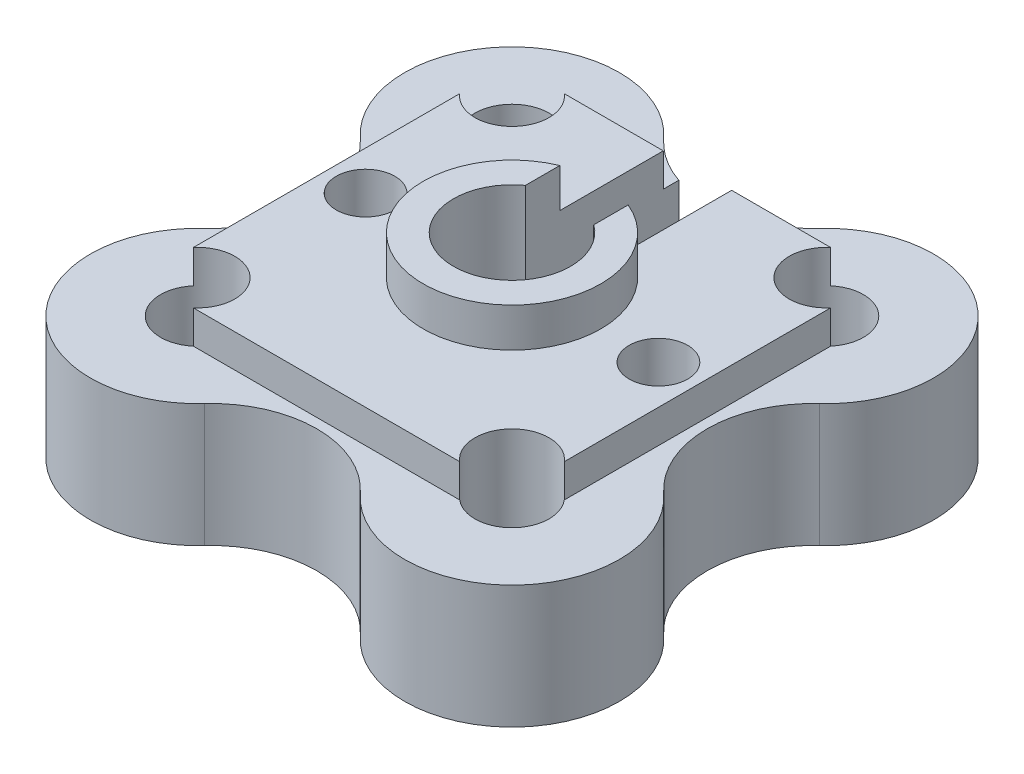
ISO-10303-21;
HEADER;
FILE_DESCRIPTION(('STEP AP214'),'2;1');
FILE_NAME('part.step','',(''),(''),'','','');
FILE_SCHEMA(('AUTOMOTIVE_DESIGN { 1 0 10303 214 1 1 1 1 }'));
ENDSEC;
DATA;
#1=APPLICATION_CONTEXT('core data for automotive mechanical design processes');
#2=APPLICATION_PROTOCOL_DEFINITION('international standard','automotive_design',2000,#1);
#3=PRODUCT_CONTEXT('',#1,'mechanical');
#4=PRODUCT('Part','Part','',(#3));
#5=PRODUCT_RELATED_PRODUCT_CATEGORY('part','',(#4));
#6=PRODUCT_DEFINITION_FORMATION('','',#4);
#7=PRODUCT_DEFINITION_CONTEXT('part definition',#1,'design');
#8=PRODUCT_DEFINITION('design','',#6,#7);
#9=PRODUCT_DEFINITION_SHAPE('','',#8);
#10=(LENGTH_UNIT() NAMED_UNIT(*) SI_UNIT(.MILLI.,.METRE.));
#11=(NAMED_UNIT(*) PLANE_ANGLE_UNIT() SI_UNIT($,.RADIAN.));
#12=(NAMED_UNIT(*) SI_UNIT($,.STERADIAN.) SOLID_ANGLE_UNIT());
#13=UNCERTAINTY_MEASURE_WITH_UNIT(LENGTH_MEASURE(1.E-05),#10,'distance_accuracy_value','');
#14=(GEOMETRIC_REPRESENTATION_CONTEXT(3) GLOBAL_UNCERTAINTY_ASSIGNED_CONTEXT((#13)) GLOBAL_UNIT_ASSIGNED_CONTEXT((#10,
#11,#12)) REPRESENTATION_CONTEXT('',''));
#15=CARTESIAN_POINT('',(0.,0.,0.));
#16=DIRECTION('',(0.,0.,1.));
#17=DIRECTION('',(1.,0.,0.));
#18=AXIS2_PLACEMENT_3D('',#15,#16,#17);
#19=CARTESIAN_POINT('',(0.,6.3,-15.4021126760563));
#20=DIRECTION('',(0.,-1.,0.));
#21=DIRECTION('',(0.,0.,-1.));
#22=AXIS2_PLACEMENT_3D('',#19,#20,#21);
#23=CYLINDRICAL_SURFACE('',#22,5.40211267605633);
#24=CARTESIAN_POINT('',(0.,6.3,-15.4021126760563));
#25=DIRECTION('',(0.,-1.,0.));
#26=DIRECTION('',(0.,0.,1.));
#27=AXIS2_PLACEMENT_3D('',#24,#25,#26);
#28=CIRCLE('',#27,5.40211267605633);
#29=CARTESIAN_POINT('',(-1.75,6.3,-10.2913083005389));
#30=VERTEX_POINT('',#29);
#31=CARTESIAN_POINT('',(-3.98886053872489,6.3,-11.7590627220464));
#32=VERTEX_POINT('',#31);
#33=EDGE_CURVE('E365',#30,#32,#28,.T.);
#34=ORIENTED_EDGE('',*,*,#33,.F.);
#35=DIRECTION('',(0.,-1.,0.));
#36=VECTOR('',#35,1.);
#37=CARTESIAN_POINT('',(-1.75,6.3,-10.2913083005389));
#38=LINE('',#37,#36);
#39=CARTESIAN_POINT('',(-1.75,0.,-10.2913083005389));
#40=VERTEX_POINT('',#39);
#41=EDGE_CURVE('E446',#30,#40,#38,.T.);
#42=ORIENTED_EDGE('',*,*,#41,.T.);
#43=CARTESIAN_POINT('',(0.,0.,-15.4021126760563));
#44=DIRECTION('',(0.,-1.,0.));
#45=DIRECTION('',(0.,0.,1.));
#46=AXIS2_PLACEMENT_3D('',#43,#44,#45);
#47=CIRCLE('',#46,5.40211267605633);
#48=CARTESIAN_POINT('',(-3.98886053872489,0.,-11.7590627220464));
#49=VERTEX_POINT('',#48);
#50=EDGE_CURVE('E385',#40,#49,#47,.T.);
#51=ORIENTED_EDGE('',*,*,#50,.T.);
#52=DIRECTION('',(0.,-1.,0.));
#53=VECTOR('',#52,1.);
#54=CARTESIAN_POINT('',(-3.98886053872489,6.3,-11.7590627220464));
#55=LINE('',#54,#53);
#56=EDGE_CURVE('E234',#32,#49,#55,.T.);
#57=ORIENTED_EDGE('',*,*,#56,.F.);
#58=EDGE_LOOP('',(#34,#42,#51,#57));
#59=FACE_BOUND('',#58,.T.);
#60=ADVANCED_FACE('F34',(#59),#23,.F.);
#61=CARTESIAN_POINT('',(6.82219708423337,8.,-9.5));
#62=DIRECTION('',(0.,0.,1.));
#63=DIRECTION('',(1.,0.,0.));
#64=AXIS2_PLACEMENT_3D('',#61,#62,#63);
#65=PLANE('',#64);
#66=DIRECTION('',(-1.,0.,0.));
#67=VECTOR('',#66,1.);
#68=CARTESIAN_POINT('',(6.82219708423337,8.,-9.5));
#69=LINE('',#68,#67);
#70=CARTESIAN_POINT('',(-1.75,8.,-9.5));
#71=VERTEX_POINT('',#70);
#72=CARTESIAN_POINT('',(-6.82219708421912,8.,-9.5));
#73=VERTEX_POINT('',#72);
#74=EDGE_CURVE('E470',#71,#73,#69,.T.);
#75=ORIENTED_EDGE('',*,*,#74,.F.);
#76=DIRECTION('',(0.,-1.,0.));
#77=VECTOR('',#76,1.);
#78=CARTESIAN_POINT('',(-1.75,8.,-9.5));
#79=LINE('',#78,#77);
#80=CARTESIAN_POINT('',(-1.75,6.3,-9.5));
#81=VERTEX_POINT('',#80);
#82=EDGE_CURVE('E451',#71,#81,#79,.T.);
#83=ORIENTED_EDGE('',*,*,#82,.T.);
#84=DIRECTION('',(-1.,0.,0.));
#85=VECTOR('',#84,1.);
#86=CARTESIAN_POINT('',(6.82219708423337,6.3,-9.5));
#87=LINE('',#86,#85);
#88=CARTESIAN_POINT('',(-6.82219708421913,6.3,-9.5));
#89=VERTEX_POINT('',#88);
#90=EDGE_CURVE('E38',#81,#89,#87,.T.);
#91=ORIENTED_EDGE('',*,*,#90,.T.);
#92=DIRECTION('',(0.,-1.,0.));
#93=VECTOR('',#92,1.);
#94=CARTESIAN_POINT('',(-6.82219708421912,8.,-9.5));
#95=LINE('',#94,#93);
#96=EDGE_CURVE('E243',#73,#89,#95,.T.);
#97=ORIENTED_EDGE('',*,*,#96,.F.);
#98=EDGE_LOOP('',(#75,#83,#91,#97));
#99=FACE_BOUND('',#98,.T.);
#100=ADVANCED_FACE('F514',(#99),#65,.F.);
#101=CARTESIAN_POINT('',(8.05,8.,8.05));
#102=DIRECTION('',(0.,1.,0.));
#103=DIRECTION('',(0.,0.,1.));
#104=AXIS2_PLACEMENT_3D('',#101,#102,#103);
#105=PLANE('',#104);
#106=DIRECTION('',(0.,0.,1.));
#107=VECTOR('',#106,1.);
#108=CARTESIAN_POINT('',(-1.75,8.,8.05));
#109=LINE('',#108,#107);
#110=CARTESIAN_POINT('',(-1.75,8.,-4.2));
#111=VERTEX_POINT('',#110);
#112=EDGE_CURVE('E510',#71,#111,#109,.T.);
#113=ORIENTED_EDGE('',*,*,#112,.F.);
#114=ORIENTED_EDGE('',*,*,#74,.T.);
#115=CARTESIAN_POINT('',(-8.05,8.,-8.05));
#116=DIRECTION('',(0.,-1.,0.));
#117=DIRECTION('',(0.,0.,1.));
#118=AXIS2_PLACEMENT_3D('',#115,#116,#117);
#119=CIRCLE('',#118,1.9);
#120=CARTESIAN_POINT('',(-9.5,8.,-6.82219708421913));
#121=VERTEX_POINT('',#120);
#122=EDGE_CURVE('E285',#73,#121,#119,.T.);
#123=ORIENTED_EDGE('',*,*,#122,.T.);
#124=DIRECTION('',(0.,0.,1.));
#125=VECTOR('',#124,1.);
#126=CARTESIAN_POINT('',(-9.5,8.,-6.82219708421913));
#127=LINE('',#126,#125);
#128=CARTESIAN_POINT('',(-9.5,8.,6.82219708423032));
#129=VERTEX_POINT('',#128);
#130=EDGE_CURVE('E281',#121,#129,#127,.T.);
#131=ORIENTED_EDGE('',*,*,#130,.T.);
#132=CARTESIAN_POINT('',(-8.05,8.,8.05));
#133=DIRECTION('',(0.,-1.,0.));
#134=DIRECTION('',(0.,0.,1.));
#135=AXIS2_PLACEMENT_3D('',#132,#133,#134);
#136=CIRCLE('',#135,1.89999999999277);
#137=CARTESIAN_POINT('',(-6.82219708423033,8.,9.5));
#138=VERTEX_POINT('',#137);
#139=EDGE_CURVE('E336',#129,#138,#136,.T.);
#140=ORIENTED_EDGE('',*,*,#139,.T.);
#141=DIRECTION('',(1.,0.,0.));
#142=VECTOR('',#141,1.);
#143=CARTESIAN_POINT('',(-6.82219708423033,8.,9.5));
#144=LINE('',#143,#142);
#145=CARTESIAN_POINT('',(6.82219708421913,8.,9.5));
#146=VERTEX_POINT('',#145);
#147=EDGE_CURVE('E324',#138,#146,#144,.T.);
#148=ORIENTED_EDGE('',*,*,#147,.T.);
#149=CARTESIAN_POINT('',(8.05,8.,8.05));
#150=DIRECTION('',(0.,-1.,0.));
#151=DIRECTION('',(0.,0.,1.));
#152=AXIS2_PLACEMENT_3D('',#149,#150,#151);
#153=CIRCLE('',#152,1.9);
#154=CARTESIAN_POINT('',(9.5,8.,6.82219708421914));
#155=VERTEX_POINT('',#154);
#156=EDGE_CURVE('E320',#146,#155,#153,.T.);
#157=ORIENTED_EDGE('',*,*,#156,.T.);
#158=DIRECTION('',(0.,0.,-1.));
#159=VECTOR('',#158,1.);
#160=CARTESIAN_POINT('',(9.5,8.,6.82219708421914));
#161=LINE('',#160,#159);
#162=CARTESIAN_POINT('',(9.5,8.,-6.82219708423337));
#163=VERTEX_POINT('',#162);
#164=EDGE_CURVE('E466',#155,#163,#161,.T.);
#165=ORIENTED_EDGE('',*,*,#164,.T.);
#166=CARTESIAN_POINT('',(8.05,8.,-8.05));
#167=DIRECTION('',(0.,-1.,0.));
#168=DIRECTION('',(0.,0.,1.));
#169=AXIS2_PLACEMENT_3D('',#166,#167,#168);
#170=CIRCLE('',#169,1.8999999999908);
#171=CARTESIAN_POINT('',(6.82219708423337,8.,-9.5));
#172=VERTEX_POINT('',#171);
#173=EDGE_CURVE('E468',#163,#172,#170,.T.);
#174=ORIENTED_EDGE('',*,*,#173,.T.);
#175=CARTESIAN_POINT('',(1.75,8.,-9.5));
#176=VERTEX_POINT('',#175);
#177=EDGE_CURVE('E471',#172,#176,#69,.T.);
#178=ORIENTED_EDGE('',*,*,#177,.T.);
#179=DIRECTION('',(0.,0.,-1.));
#180=VECTOR('',#179,1.);
#181=CARTESIAN_POINT('',(1.75,8.,8.05));
#182=LINE('',#181,#180);
#183=CARTESIAN_POINT('',(1.75,8.,-4.2));
#184=VERTEX_POINT('',#183);
#185=EDGE_CURVE('E497',#184,#176,#182,.T.);
#186=ORIENTED_EDGE('',*,*,#185,.F.);
#187=CARTESIAN_POINT('',(0.,8.,0.));
#188=DIRECTION('',(0.,1.,0.));
#189=DIRECTION('',(0.,0.,1.));
#190=AXIS2_PLACEMENT_3D('',#187,#188,#189);
#191=CIRCLE('',#190,4.55);
#192=EDGE_CURVE('E459',#111,#184,#191,.T.);
#193=ORIENTED_EDGE('',*,*,#192,.F.);
#194=EDGE_LOOP('',(#113,#114,#123,#131,#140,#148,#157,#165,#174,#178,#186,#193));
#195=FACE_BOUND('',#194,.T.);
#196=CARTESIAN_POINT('',(-7.5,8.,0.));
#197=DIRECTION('',(0.,1.,0.));
#198=DIRECTION('',(0.,0.,1.));
#199=AXIS2_PLACEMENT_3D('',#196,#197,#198);
#200=CIRCLE('',#199,1.5);
#201=CARTESIAN_POINT('',(-7.5,8.,1.5));
#202=VERTEX_POINT('',#201);
#203=EDGE_CURVE('E456',#202,#202,#200,.F.);
#204=ORIENTED_EDGE('',*,*,#203,.T.);
#205=EDGE_LOOP('',(#204));
#206=FACE_BOUND('',#205,.T.);
#207=CARTESIAN_POINT('',(7.5,8.,0.));
#208=DIRECTION('',(0.,1.,0.));
#209=DIRECTION('',(0.,0.,1.));
#210=AXIS2_PLACEMENT_3D('',#207,#208,#209);
#211=CIRCLE('',#210,1.5);
#212=CARTESIAN_POINT('',(7.5,8.,1.5));
#213=VERTEX_POINT('',#212);
#214=EDGE_CURVE('E447',#213,#213,#211,.F.);
#215=ORIENTED_EDGE('',*,*,#214,.T.);
#216=EDGE_LOOP('',(#215));
#217=FACE_BOUND('',#216,.T.);
#218=ADVANCED_FACE('F478',(#195,#206,#217),#105,.T.);
#219=CARTESIAN_POINT('',(4.025,0.,-11.7260563380282));
#220=DIRECTION('',(0.,1.,0.));
#221=DIRECTION('',(0.,0.,1.));
#222=AXIS2_PLACEMENT_3D('',#219,#220,#221);
#223=PLANE('',#222);
#224=CARTESIAN_POINT('',(7.5,0.,0.));
#225=DIRECTION('',(0.,1.,0.));
#226=DIRECTION('',(0.,0.,1.));
#227=AXIS2_PLACEMENT_3D('',#224,#225,#226);
#228=CIRCLE('',#227,1.5);
#229=CARTESIAN_POINT('',(7.5,0.,1.5));
#230=VERTEX_POINT('',#229);
#231=EDGE_CURVE('E293',#230,#230,#228,.T.);
#232=ORIENTED_EDGE('',*,*,#231,.T.);
#233=EDGE_LOOP('',(#232));
#234=FACE_BOUND('',#233,.T.);
#235=CARTESIAN_POINT('',(-7.5,0.,0.));
#236=DIRECTION('',(0.,1.,0.));
#237=DIRECTION('',(0.,0.,1.));
#238=AXIS2_PLACEMENT_3D('',#235,#236,#237);
#239=CIRCLE('',#238,1.5);
#240=CARTESIAN_POINT('',(-7.5,0.,1.5));
#241=VERTEX_POINT('',#240);
#242=EDGE_CURVE('E358',#241,#241,#239,.T.);
#243=ORIENTED_EDGE('',*,*,#242,.T.);
#244=EDGE_LOOP('',(#243));
#245=FACE_BOUND('',#244,.T.);
#246=ORIENTED_EDGE('',*,*,#50,.F.);
#247=DIRECTION('',(0.,0.,1.));
#248=VECTOR('',#247,1.);
#249=CARTESIAN_POINT('',(-1.75,0.,0.));
#250=LINE('',#249,#248);
#251=CARTESIAN_POINT('',(-1.75,0.,0.));
#252=VERTEX_POINT('',#251);
#253=EDGE_CURVE('E527',#40,#252,#250,.T.);
#254=ORIENTED_EDGE('',*,*,#253,.T.);
#255=CARTESIAN_POINT('',(0.,0.,0.));
#256=DIRECTION('',(0.,1.,0.));
#257=DIRECTION('',(0.,0.,-1.));
#258=AXIS2_PLACEMENT_3D('',#255,#256,#257);
#259=CIRCLE('',#258,1.75);
#260=CARTESIAN_POINT('',(1.75,0.,0.));
#261=VERTEX_POINT('',#260);
#262=EDGE_CURVE('E225',#252,#261,#259,.T.);
#263=ORIENTED_EDGE('',*,*,#262,.T.);
#264=DIRECTION('',(0.,0.,-1.));
#265=VECTOR('',#264,1.);
#266=CARTESIAN_POINT('',(1.75,0.,0.));
#267=LINE('',#266,#265);
#268=CARTESIAN_POINT('',(1.75,0.,-10.2913083005389));
#269=VERTEX_POINT('',#268);
#270=EDGE_CURVE('E523',#261,#269,#267,.T.);
#271=ORIENTED_EDGE('',*,*,#270,.T.);
#272=CARTESIAN_POINT('',(3.98886053872489,0.,-11.7590627220464));
#273=VERTEX_POINT('',#272);
#274=EDGE_CURVE('E386',#273,#269,#47,.T.);
#275=ORIENTED_EDGE('',*,*,#274,.F.);
#276=CARTESIAN_POINT('',(8.05,0.,-8.05));
#277=DIRECTION('',(0.,1.,0.));
#278=DIRECTION('',(0.,0.,1.));
#279=AXIS2_PLACEMENT_3D('',#276,#277,#278);
#280=CIRCLE('',#279,5.5);
#281=CARTESIAN_POINT('',(11.7590627220464,0.,-3.98886053872489));
#282=VERTEX_POINT('',#281);
#283=EDGE_CURVE('E361',#282,#273,#280,.T.);
#284=ORIENTED_EDGE('',*,*,#283,.F.);
#285=CARTESIAN_POINT('',(15.4021126760563,0.,0.));
#286=DIRECTION('',(0.,-1.,0.));
#287=DIRECTION('',(0.,0.,1.));
#288=AXIS2_PLACEMENT_3D('',#285,#286,#287);
#289=CIRCLE('',#288,5.40211267605634);
#290=CARTESIAN_POINT('',(11.7590627220464,0.,3.98886053872489));
#291=VERTEX_POINT('',#290);
#292=EDGE_CURVE('E366',#291,#282,#289,.T.);
#293=ORIENTED_EDGE('',*,*,#292,.F.);
#294=CARTESIAN_POINT('',(8.05,0.,8.05));
#295=DIRECTION('',(0.,1.,0.));
#296=DIRECTION('',(0.,0.,-1.));
#297=AXIS2_PLACEMENT_3D('',#294,#295,#296);
#298=CIRCLE('',#297,5.5);
#299=CARTESIAN_POINT('',(3.98886053872489,0.,11.7590627220464));
#300=VERTEX_POINT('',#299);
#301=EDGE_CURVE('E397',#300,#291,#298,.T.);
#302=ORIENTED_EDGE('',*,*,#301,.F.);
#303=CARTESIAN_POINT('',(0.,0.,15.4021126760563));
#304=DIRECTION('',(0.,-1.,0.));
#305=DIRECTION('',(0.,0.,-1.));
#306=AXIS2_PLACEMENT_3D('',#303,#304,#305);
#307=CIRCLE('',#306,5.40211267605633);
#308=CARTESIAN_POINT('',(-3.98886053872489,0.,11.7590627220464));
#309=VERTEX_POINT('',#308);
#310=EDGE_CURVE('E395',#309,#300,#307,.T.);
#311=ORIENTED_EDGE('',*,*,#310,.F.);
#312=CARTESIAN_POINT('',(-8.05,0.,8.05));
#313=DIRECTION('',(0.,1.,0.));
#314=DIRECTION('',(0.,0.,-1.));
#315=AXIS2_PLACEMENT_3D('',#312,#313,#314);
#316=CIRCLE('',#315,5.5);
#317=CARTESIAN_POINT('',(-11.7590627220464,0.,3.98886053872489));
#318=VERTEX_POINT('',#317);
#319=EDGE_CURVE('E393',#318,#309,#316,.T.);
#320=ORIENTED_EDGE('',*,*,#319,.F.);
#321=CARTESIAN_POINT('',(-15.4021126760563,0.,0.));
#322=DIRECTION('',(0.,-1.,0.));
#323=DIRECTION('',(0.,0.,1.));
#324=AXIS2_PLACEMENT_3D('',#321,#322,#323);
#325=CIRCLE('',#324,5.40211267605634);
#326=CARTESIAN_POINT('',(-11.7590627220464,0.,-3.98886053872489));
#327=VERTEX_POINT('',#326);
#328=EDGE_CURVE('E391',#327,#318,#325,.T.);
#329=ORIENTED_EDGE('',*,*,#328,.F.);
#330=CARTESIAN_POINT('',(-8.05,0.,-8.05));
#331=DIRECTION('',(0.,1.,0.));
#332=DIRECTION('',(0.,0.,1.));
#333=AXIS2_PLACEMENT_3D('',#330,#331,#332);
#334=CIRCLE('',#333,5.5);
#335=EDGE_CURVE('E389',#49,#327,#334,.T.);
#336=ORIENTED_EDGE('',*,*,#335,.F.);
#337=EDGE_LOOP('',(#246,#254,#263,#271,#275,#284,#293,#302,#311,#320,#329,#336));
#338=FACE_BOUND('',#337,.T.);
#339=ADVANCED_FACE('F429',(#234,#245,#338),#223,.F.);
#340=CARTESIAN_POINT('',(0.,10.,0.));
#341=DIRECTION('',(0.,1.,0.));
#342=DIRECTION('',(0.,0.,1.));
#343=AXIS2_PLACEMENT_3D('',#340,#341,#342);
#344=PLANE('',#343);
#345=DIRECTION('',(0.,0.,1.));
#346=VECTOR('',#345,1.);
#347=CARTESIAN_POINT('',(-1.75,10.,0.));
#348=LINE('',#347,#346);
#349=CARTESIAN_POINT('',(-1.75,10.,-4.2));
#350=VERTEX_POINT('',#349);
#351=CARTESIAN_POINT('',(-1.75,10.,-2.43669858620224));
#352=VERTEX_POINT('',#351);
#353=EDGE_CURVE('E50',#350,#352,#348,.T.);
#354=ORIENTED_EDGE('',*,*,#353,.F.);
#355=CARTESIAN_POINT('',(0.,10.,0.));
#356=DIRECTION('',(0.,1.,0.));
#357=DIRECTION('',(0.,0.,1.));
#358=AXIS2_PLACEMENT_3D('',#355,#356,#357);
#359=CIRCLE('',#358,4.55);
#360=CARTESIAN_POINT('',(1.75,10.,-4.2));
#361=VERTEX_POINT('',#360);
#362=EDGE_CURVE('E307',#350,#361,#359,.T.);
#363=ORIENTED_EDGE('',*,*,#362,.T.);
#364=DIRECTION('',(0.,0.,-1.));
#365=VECTOR('',#364,1.);
#366=CARTESIAN_POINT('',(1.75,10.,0.));
#367=LINE('',#366,#365);
#368=CARTESIAN_POINT('',(1.75,10.,-2.43669858620224));
#369=VERTEX_POINT('',#368);
#370=EDGE_CURVE('E524',#369,#361,#367,.T.);
#371=ORIENTED_EDGE('',*,*,#370,.F.);
#372=CARTESIAN_POINT('',(0.,10.,0.));
#373=DIRECTION('',(0.,1.,0.));
#374=DIRECTION('',(0.,0.,1.));
#375=AXIS2_PLACEMENT_3D('',#372,#373,#374);
#376=CIRCLE('',#375,3.);
#377=EDGE_CURVE('E230',#352,#369,#376,.T.);
#378=ORIENTED_EDGE('',*,*,#377,.F.);
#379=EDGE_LOOP('',(#354,#363,#371,#378));
#380=FACE_BOUND('',#379,.T.);
#381=ADVANCED_FACE('F522',(#380),#344,.T.);
#382=CARTESIAN_POINT('',(4.025,6.3,-11.7260563380282));
#383=DIRECTION('',(0.,1.,0.));
#384=DIRECTION('',(0.,0.,1.));
#385=AXIS2_PLACEMENT_3D('',#382,#383,#384);
#386=PLANE('',#385);
#387=DIRECTION('',(0.,0.,1.));
#388=VECTOR('',#387,1.);
#389=CARTESIAN_POINT('',(-1.75,6.3,-11.7260563380282));
#390=LINE('',#389,#388);
#391=EDGE_CURVE('E444',#30,#81,#390,.T.);
#392=ORIENTED_EDGE('',*,*,#391,.F.);
#393=ORIENTED_EDGE('',*,*,#33,.T.);
#394=CARTESIAN_POINT('',(-8.05,6.3,-8.05));
#395=DIRECTION('',(0.,1.,0.));
#396=DIRECTION('',(0.,0.,1.));
#397=AXIS2_PLACEMENT_3D('',#394,#395,#396);
#398=CIRCLE('',#397,5.5);
#399=CARTESIAN_POINT('',(-11.7590627220464,6.3,-3.98886053872489));
#400=VERTEX_POINT('',#399);
#401=EDGE_CURVE('E370',#32,#400,#398,.T.);
#402=ORIENTED_EDGE('',*,*,#401,.T.);
#403=CARTESIAN_POINT('',(-15.4021126760563,6.3,0.));
#404=DIRECTION('',(0.,-1.,0.));
#405=DIRECTION('',(0.,0.,1.));
#406=AXIS2_PLACEMENT_3D('',#403,#404,#405);
#407=CIRCLE('',#406,5.40211267605634);
#408=CARTESIAN_POINT('',(-11.7590627220464,6.3,3.98886053872489));
#409=VERTEX_POINT('',#408);
#410=EDGE_CURVE('E372',#400,#409,#407,.T.);
#411=ORIENTED_EDGE('',*,*,#410,.T.);
#412=CARTESIAN_POINT('',(-8.05,6.3,8.05));
#413=DIRECTION('',(0.,1.,0.));
#414=DIRECTION('',(0.,0.,-1.));
#415=AXIS2_PLACEMENT_3D('',#412,#413,#414);
#416=CIRCLE('',#415,5.5);
#417=CARTESIAN_POINT('',(-3.98886053872489,6.3,11.7590627220464));
#418=VERTEX_POINT('',#417);
#419=EDGE_CURVE('E374',#409,#418,#416,.T.);
#420=ORIENTED_EDGE('',*,*,#419,.T.);
#421=CARTESIAN_POINT('',(0.,6.3,15.4021126760563));
#422=DIRECTION('',(0.,-1.,0.));
#423=DIRECTION('',(0.,0.,-1.));
#424=AXIS2_PLACEMENT_3D('',#421,#422,#423);
#425=CIRCLE('',#424,5.40211267605633);
#426=CARTESIAN_POINT('',(3.98886053872489,6.3,11.7590627220464));
#427=VERTEX_POINT('',#426);
#428=EDGE_CURVE('E376',#418,#427,#425,.T.);
#429=ORIENTED_EDGE('',*,*,#428,.T.);
#430=CARTESIAN_POINT('',(8.05,6.3,8.05));
#431=DIRECTION('',(0.,1.,0.));
#432=DIRECTION('',(0.,0.,-1.));
#433=AXIS2_PLACEMENT_3D('',#430,#431,#432);
#434=CIRCLE('',#433,5.5);
#435=CARTESIAN_POINT('',(11.7590627220464,6.3,3.98886053872489));
#436=VERTEX_POINT('',#435);
#437=EDGE_CURVE('E378',#427,#436,#434,.T.);
#438=ORIENTED_EDGE('',*,*,#437,.T.);
#439=CARTESIAN_POINT('',(15.4021126760563,6.3,0.));
#440=DIRECTION('',(0.,-1.,0.));
#441=DIRECTION('',(0.,0.,1.));
#442=AXIS2_PLACEMENT_3D('',#439,#440,#441);
#443=CIRCLE('',#442,5.40211267605634);
#444=CARTESIAN_POINT('',(11.7590627220464,6.3,-3.98886053872489));
#445=VERTEX_POINT('',#444);
#446=EDGE_CURVE('E380',#436,#445,#443,.T.);
#447=ORIENTED_EDGE('',*,*,#446,.T.);
#448=CARTESIAN_POINT('',(8.05,6.3,-8.05));
#449=DIRECTION('',(0.,1.,0.));
#450=DIRECTION('',(0.,0.,1.));
#451=AXIS2_PLACEMENT_3D('',#448,#449,#450);
#452=CIRCLE('',#451,5.5);
#453=CARTESIAN_POINT('',(3.98886053872489,6.3,-11.7590627220464));
#454=VERTEX_POINT('',#453);
#455=EDGE_CURVE('E362',#445,#454,#452,.T.);
#456=ORIENTED_EDGE('',*,*,#455,.T.);
#457=CARTESIAN_POINT('',(1.75,6.3,-10.2913083005389));
#458=VERTEX_POINT('',#457);
#459=EDGE_CURVE('E367',#454,#458,#28,.T.);
#460=ORIENTED_EDGE('',*,*,#459,.T.);
#461=DIRECTION('',(0.,0.,-1.));
#462=VECTOR('',#461,1.);
#463=CARTESIAN_POINT('',(1.75,6.3,-11.7260563380282));
#464=LINE('',#463,#462);
#465=CARTESIAN_POINT('',(1.75,6.3,-9.5));
#466=VERTEX_POINT('',#465);
#467=EDGE_CURVE('E496',#466,#458,#464,.T.);
#468=ORIENTED_EDGE('',*,*,#467,.F.);
#469=CARTESIAN_POINT('',(6.82219708423337,6.3,-9.5));
#470=VERTEX_POINT('',#469);
#471=EDGE_CURVE('E249',#470,#466,#87,.T.);
#472=ORIENTED_EDGE('',*,*,#471,.F.);
#473=CARTESIAN_POINT('',(8.05,6.3,-8.05));
#474=DIRECTION('',(0.,1.,0.));
#475=DIRECTION('',(0.,0.,1.));
#476=AXIS2_PLACEMENT_3D('',#473,#474,#475);
#477=CIRCLE('',#476,1.8999999999908);
#478=CARTESIAN_POINT('',(9.5,6.3,-6.82219708423337));
#479=VERTEX_POINT('',#478);
#480=EDGE_CURVE('E296',#479,#470,#477,.T.);
#481=ORIENTED_EDGE('',*,*,#480,.F.);
#482=DIRECTION('',(0.,0.,-1.));
#483=VECTOR('',#482,1.);
#484=CARTESIAN_POINT('',(9.5,6.3,6.82219708421914));
#485=LINE('',#484,#483);
#486=CARTESIAN_POINT('',(9.5,6.3,6.82219708421913));
#487=VERTEX_POINT('',#486);
#488=EDGE_CURVE('E304',#487,#479,#485,.T.);
#489=ORIENTED_EDGE('',*,*,#488,.F.);
#490=CARTESIAN_POINT('',(8.05,6.3,8.05));
#491=DIRECTION('',(0.,1.,0.));
#492=DIRECTION('',(0.,0.,1.));
#493=AXIS2_PLACEMENT_3D('',#490,#491,#492);
#494=CIRCLE('',#493,1.9);
#495=CARTESIAN_POINT('',(6.82219708421913,6.3,9.5));
#496=VERTEX_POINT('',#495);
#497=EDGE_CURVE('E340',#496,#487,#494,.T.);
#498=ORIENTED_EDGE('',*,*,#497,.F.);
#499=DIRECTION('',(1.,0.,0.));
#500=VECTOR('',#499,1.);
#501=CARTESIAN_POINT('',(-6.82219708423033,6.3,9.5));
#502=LINE('',#501,#500);
#503=CARTESIAN_POINT('',(-6.82219708423033,6.3,9.5));
#504=VERTEX_POINT('',#503);
#505=EDGE_CURVE('E267',#504,#496,#502,.T.);
#506=ORIENTED_EDGE('',*,*,#505,.F.);
#507=CARTESIAN_POINT('',(-8.05,6.3,8.05));
#508=DIRECTION('',(0.,1.,0.));
#509=DIRECTION('',(0.,0.,1.));
#510=AXIS2_PLACEMENT_3D('',#507,#508,#509);
#511=CIRCLE('',#510,1.89999999999277);
#512=CARTESIAN_POINT('',(-9.5,6.3,6.82219708423032));
#513=VERTEX_POINT('',#512);
#514=EDGE_CURVE('E315',#513,#504,#511,.T.);
#515=ORIENTED_EDGE('',*,*,#514,.F.);
#516=DIRECTION('',(0.,0.,1.));
#517=VECTOR('',#516,1.);
#518=CARTESIAN_POINT('',(-9.5,6.3,-6.82219708421913));
#519=LINE('',#518,#517);
#520=CARTESIAN_POINT('',(-9.5,6.3,-6.82219708421913));
#521=VERTEX_POINT('',#520);
#522=EDGE_CURVE('E58',#521,#513,#519,.T.);
#523=ORIENTED_EDGE('',*,*,#522,.F.);
#524=CARTESIAN_POINT('',(-8.05,6.3,-8.05));
#525=DIRECTION('',(0.,1.,0.));
#526=DIRECTION('',(0.,0.,1.));
#527=AXIS2_PLACEMENT_3D('',#524,#525,#526);
#528=CIRCLE('',#527,1.9);
#529=EDGE_CURVE('E286',#89,#521,#528,.T.);
#530=ORIENTED_EDGE('',*,*,#529,.F.);
#531=ORIENTED_EDGE('',*,*,#90,.F.);
#532=EDGE_LOOP('',(#392,#393,#402,#411,#420,#429,#438,#447,#456,#460,#468,#472,#481,#489,#498,
#506,#515,#523,#530,#531));
#533=FACE_BOUND('',#532,.T.);
#534=ADVANCED_FACE('F442',(#533),#386,.T.);
#535=CARTESIAN_POINT('',(8.05,6.3,-8.05));
#536=DIRECTION('',(0.,-1.,0.));
#537=DIRECTION('',(0.,0.,-1.));
#538=AXIS2_PLACEMENT_3D('',#535,#536,#537);
#539=CYLINDRICAL_SURFACE('',#538,5.5);
#540=ORIENTED_EDGE('',*,*,#283,.T.);
#541=DIRECTION('',(0.,-1.,0.));
#542=VECTOR('',#541,1.);
#543=CARTESIAN_POINT('',(3.98886053872489,6.3,-11.7590627220464));
#544=LINE('',#543,#542);
#545=EDGE_CURVE('E231',#454,#273,#544,.T.);
#546=ORIENTED_EDGE('',*,*,#545,.F.);
#547=ORIENTED_EDGE('',*,*,#455,.F.);
#548=DIRECTION('',(0.,-1.,0.));
#549=VECTOR('',#548,1.);
#550=CARTESIAN_POINT('',(11.7590627220464,6.3,-3.98886053872489));
#551=LINE('',#550,#549);
#552=EDGE_CURVE('E382',#445,#282,#551,.T.);
#553=ORIENTED_EDGE('',*,*,#552,.T.);
#554=EDGE_LOOP('',(#540,#546,#547,#553));
#555=FACE_BOUND('',#554,.T.);
#556=ADVANCED_FACE('F36',(#555),#539,.T.);
#557=ORIENTED_EDGE('',*,*,#274,.T.);
#558=DIRECTION('',(0.,-1.,0.));
#559=VECTOR('',#558,1.);
#560=CARTESIAN_POINT('',(1.75,6.3,-10.2913083005389));
#561=LINE('',#560,#559);
#562=EDGE_CURVE('E499',#269,#458,#561,.F.);
#563=ORIENTED_EDGE('',*,*,#562,.T.);
#564=ORIENTED_EDGE('',*,*,#459,.F.);
#565=ORIENTED_EDGE('',*,*,#545,.T.);
#566=EDGE_LOOP('',(#557,#563,#564,#565));
#567=FACE_BOUND('',#566,.T.);
#568=ADVANCED_FACE('F551',(#567),#23,.F.);
#569=CARTESIAN_POINT('',(-8.05,6.3,-8.05));
#570=DIRECTION('',(0.,-1.,0.));
#571=DIRECTION('',(0.,0.,-1.));
#572=AXIS2_PLACEMENT_3D('',#569,#570,#571);
#573=CYLINDRICAL_SURFACE('',#572,5.5);
#574=ORIENTED_EDGE('',*,*,#335,.T.);
#575=DIRECTION('',(0.,-1.,0.));
#576=VECTOR('',#575,1.);
#577=CARTESIAN_POINT('',(-11.7590627220464,6.3,-3.98886053872489));
#578=LINE('',#577,#576);
#579=EDGE_CURVE('E414',#400,#327,#578,.T.);
#580=ORIENTED_EDGE('',*,*,#579,.F.);
#581=ORIENTED_EDGE('',*,*,#401,.F.);
#582=ORIENTED_EDGE('',*,*,#56,.T.);
#583=EDGE_LOOP('',(#574,#580,#581,#582));
#584=FACE_BOUND('',#583,.T.);
#585=ADVANCED_FACE('F422',(#584),#573,.T.);
#586=CARTESIAN_POINT('',(-15.4021126760563,6.3,0.));
#587=DIRECTION('',(0.,-1.,0.));
#588=DIRECTION('',(0.,0.,-1.));
#589=AXIS2_PLACEMENT_3D('',#586,#587,#588);
#590=CYLINDRICAL_SURFACE('',#589,5.40211267605634);
#591=ORIENTED_EDGE('',*,*,#328,.T.);
#592=DIRECTION('',(0.,-1.,0.));
#593=VECTOR('',#592,1.);
#594=CARTESIAN_POINT('',(-11.7590627220464,6.3,3.98886053872489));
#595=LINE('',#594,#593);
#596=EDGE_CURVE('E411',#409,#318,#595,.T.);
#597=ORIENTED_EDGE('',*,*,#596,.F.);
#598=ORIENTED_EDGE('',*,*,#410,.F.);
#599=ORIENTED_EDGE('',*,*,#579,.T.);
#600=EDGE_LOOP('',(#591,#597,#598,#599));
#601=FACE_BOUND('',#600,.T.);
#602=ADVANCED_FACE('F434',(#601),#590,.F.);
#603=CARTESIAN_POINT('',(-8.05,6.3,8.05));
#604=DIRECTION('',(0.,-1.,0.));
#605=DIRECTION('',(0.,0.,-1.));
#606=AXIS2_PLACEMENT_3D('',#603,#604,#605);
#607=CYLINDRICAL_SURFACE('',#606,5.5);
#608=ORIENTED_EDGE('',*,*,#319,.T.);
#609=DIRECTION('',(0.,-1.,0.));
#610=VECTOR('',#609,1.);
#611=CARTESIAN_POINT('',(-3.98886053872489,6.3,11.7590627220464));
#612=LINE('',#611,#610);
#613=EDGE_CURVE('E408',#418,#309,#612,.T.);
#614=ORIENTED_EDGE('',*,*,#613,.F.);
#615=ORIENTED_EDGE('',*,*,#419,.F.);
#616=ORIENTED_EDGE('',*,*,#596,.T.);
#617=EDGE_LOOP('',(#608,#614,#615,#616));
#618=FACE_BOUND('',#617,.T.);
#619=ADVANCED_FACE('F438',(#618),#607,.T.);
#620=CARTESIAN_POINT('',(0.,6.3,15.4021126760563));
#621=DIRECTION('',(0.,-1.,0.));
#622=DIRECTION('',(0.,0.,-1.));
#623=AXIS2_PLACEMENT_3D('',#620,#621,#622);
#624=CYLINDRICAL_SURFACE('',#623,5.40211267605633);
#625=ORIENTED_EDGE('',*,*,#310,.T.);
#626=DIRECTION('',(0.,-1.,0.));
#627=VECTOR('',#626,1.);
#628=CARTESIAN_POINT('',(3.98886053872489,6.3,11.7590627220464));
#629=LINE('',#628,#627);
#630=EDGE_CURVE('E405',#427,#300,#629,.T.);
#631=ORIENTED_EDGE('',*,*,#630,.F.);
#632=ORIENTED_EDGE('',*,*,#428,.F.);
#633=ORIENTED_EDGE('',*,*,#613,.T.);
#634=EDGE_LOOP('',(#625,#631,#632,#633));
#635=FACE_BOUND('',#634,.T.);
#636=ADVANCED_FACE('F578',(#635),#624,.F.);
#637=CARTESIAN_POINT('',(8.05,6.3,8.05));
#638=DIRECTION('',(0.,-1.,0.));
#639=DIRECTION('',(0.,0.,-1.));
#640=AXIS2_PLACEMENT_3D('',#637,#638,#639);
#641=CYLINDRICAL_SURFACE('',#640,5.5);
#642=ORIENTED_EDGE('',*,*,#301,.T.);
#643=DIRECTION('',(0.,-1.,0.));
#644=VECTOR('',#643,1.);
#645=CARTESIAN_POINT('',(11.7590627220464,6.3,3.98886053872489));
#646=LINE('',#645,#644);
#647=EDGE_CURVE('E402',#436,#291,#646,.T.);
#648=ORIENTED_EDGE('',*,*,#647,.F.);
#649=ORIENTED_EDGE('',*,*,#437,.F.);
#650=ORIENTED_EDGE('',*,*,#630,.T.);
#651=EDGE_LOOP('',(#642,#648,#649,#650));
#652=FACE_BOUND('',#651,.T.);
#653=ADVANCED_FACE('F576',(#652),#641,.T.);
#654=CARTESIAN_POINT('',(15.4021126760563,6.3,0.));
#655=DIRECTION('',(0.,-1.,0.));
#656=DIRECTION('',(0.,0.,-1.));
#657=AXIS2_PLACEMENT_3D('',#654,#655,#656);
#658=CYLINDRICAL_SURFACE('',#657,5.40211267605634);
#659=ORIENTED_EDGE('',*,*,#292,.T.);
#660=ORIENTED_EDGE('',*,*,#552,.F.);
#661=ORIENTED_EDGE('',*,*,#446,.F.);
#662=ORIENTED_EDGE('',*,*,#647,.T.);
#663=EDGE_LOOP('',(#659,#660,#661,#662));
#664=FACE_BOUND('',#663,.T.);
#665=ADVANCED_FACE('F572',(#664),#658,.F.);
#666=CARTESIAN_POINT('',(-7.5,6.3,0.));
#667=DIRECTION('',(0.,-1.,0.));
#668=DIRECTION('',(0.,0.,-1.));
#669=AXIS2_PLACEMENT_3D('',#666,#667,#668);
#670=CYLINDRICAL_SURFACE('',#669,1.5);
#671=ORIENTED_EDGE('',*,*,#242,.F.);
#672=EDGE_LOOP('',(#671));
#673=FACE_BOUND('',#672,.T.);
#674=ORIENTED_EDGE('',*,*,#203,.F.);
#675=EDGE_LOOP('',(#674));
#676=FACE_BOUND('',#675,.T.);
#677=ADVANCED_FACE('F617',(#673,#676),#670,.F.);
#678=CARTESIAN_POINT('',(7.5,6.3,0.));
#679=DIRECTION('',(0.,-1.,0.));
#680=DIRECTION('',(0.,0.,-1.));
#681=AXIS2_PLACEMENT_3D('',#678,#679,#680);
#682=CYLINDRICAL_SURFACE('',#681,1.5);
#683=ORIENTED_EDGE('',*,*,#231,.F.);
#684=EDGE_LOOP('',(#683));
#685=FACE_BOUND('',#684,.T.);
#686=ORIENTED_EDGE('',*,*,#214,.F.);
#687=EDGE_LOOP('',(#686));
#688=FACE_BOUND('',#687,.T.);
#689=ADVANCED_FACE('F675',(#685,#688),#682,.F.);
#690=CARTESIAN_POINT('',(-8.05,-5.37401153701776,-8.05));
#691=DIRECTION('',(0.,1.,0.));
#692=DIRECTION('',(0.,0.,1.));
#693=AXIS2_PLACEMENT_3D('',#690,#691,#692);
#694=CYLINDRICAL_SURFACE('',#693,1.9);
#695=CARTESIAN_POINT('',(-8.05,1.,-8.05));
#696=DIRECTION('',(0.,1.,0.));
#697=DIRECTION('',(0.,0.,1.));
#698=AXIS2_PLACEMENT_3D('',#695,#696,#697);
#699=CIRCLE('',#698,1.9);
#700=CARTESIAN_POINT('',(-8.05,1.,-6.15));
#701=VERTEX_POINT('',#700);
#702=EDGE_CURVE('E289',#701,#701,#699,.F.);
#703=ORIENTED_EDGE('',*,*,#702,.T.);
#704=EDGE_LOOP('',(#703));
#705=FACE_BOUND('',#704,.T.);
#706=ORIENTED_EDGE('',*,*,#529,.T.);
#707=DIRECTION('',(0.,-1.,0.));
#708=VECTOR('',#707,1.);
#709=CARTESIAN_POINT('',(-9.5,8.,-6.82219708421913));
#710=LINE('',#709,#708);
#711=EDGE_CURVE('E248',#121,#521,#710,.T.);
#712=ORIENTED_EDGE('',*,*,#711,.F.);
#713=ORIENTED_EDGE('',*,*,#122,.F.);
#714=ORIENTED_EDGE('',*,*,#96,.T.);
#715=EDGE_LOOP('',(#706,#712,#713,#714));
#716=FACE_BOUND('',#715,.T.);
#717=ADVANCED_FACE('F284',(#705,#716),#694,.F.);
#718=CARTESIAN_POINT('',(4.025,1.,-11.7260563380282));
#719=DIRECTION('',(0.,1.,0.));
#720=DIRECTION('',(0.,0.,1.));
#721=AXIS2_PLACEMENT_3D('',#718,#719,#720);
#722=PLANE('',#721);
#723=ORIENTED_EDGE('',*,*,#702,.F.);
#724=EDGE_LOOP('',(#723));
#725=FACE_BOUND('',#724,.T.);
#726=ADVANCED_FACE('F623',(#725),#722,.T.);
#727=CARTESIAN_POINT('',(8.05,-5.37401153701776,-8.05));
#728=DIRECTION('',(0.,1.,0.));
#729=DIRECTION('',(0.,0.,1.));
#730=AXIS2_PLACEMENT_3D('',#727,#728,#729);
#731=CYLINDRICAL_SURFACE('',#730,1.8999999999908);
#732=CARTESIAN_POINT('',(8.05,1.,-8.05));
#733=DIRECTION('',(0.,1.,0.));
#734=DIRECTION('',(0.,0.,1.));
#735=AXIS2_PLACEMENT_3D('',#732,#733,#734);
#736=CIRCLE('',#735,1.8999999999908);
#737=CARTESIAN_POINT('',(8.05,1.,-6.1500000000092));
#738=VERTEX_POINT('',#737);
#739=EDGE_CURVE('E290',#738,#738,#736,.F.);
#740=ORIENTED_EDGE('',*,*,#739,.T.);
#741=EDGE_LOOP('',(#740));
#742=FACE_BOUND('',#741,.T.);
#743=ORIENTED_EDGE('',*,*,#480,.T.);
#744=DIRECTION('',(0.,-1.,0.));
#745=VECTOR('',#744,1.);
#746=CARTESIAN_POINT('',(6.82219708423337,8.,-9.5));
#747=LINE('',#746,#745);
#748=EDGE_CURVE('E239',#172,#470,#747,.T.);
#749=ORIENTED_EDGE('',*,*,#748,.F.);
#750=ORIENTED_EDGE('',*,*,#173,.F.);
#751=DIRECTION('',(0.,-1.,0.));
#752=VECTOR('',#751,1.);
#753=CARTESIAN_POINT('',(9.5,8.,-6.82219708423337));
#754=LINE('',#753,#752);
#755=EDGE_CURVE('E242',#163,#479,#754,.T.);
#756=ORIENTED_EDGE('',*,*,#755,.T.);
#757=EDGE_LOOP('',(#743,#749,#750,#756));
#758=FACE_BOUND('',#757,.T.);
#759=ADVANCED_FACE('F490',(#742,#758),#731,.F.);
#760=CARTESIAN_POINT('',(4.025,1.,-11.7260563380282));
#761=DIRECTION('',(0.,1.,0.));
#762=DIRECTION('',(0.,0.,1.));
#763=AXIS2_PLACEMENT_3D('',#760,#761,#762);
#764=PLANE('',#763);
#765=ORIENTED_EDGE('',*,*,#739,.F.);
#766=EDGE_LOOP('',(#765));
#767=FACE_BOUND('',#766,.T.);
#768=ADVANCED_FACE('F637',(#767),#764,.T.);
#769=CARTESIAN_POINT('',(8.05,-5.37401153701776,8.05));
#770=DIRECTION('',(0.,1.,0.));
#771=DIRECTION('',(0.,0.,1.));
#772=AXIS2_PLACEMENT_3D('',#769,#770,#771);
#773=CYLINDRICAL_SURFACE('',#772,1.9);
#774=CARTESIAN_POINT('',(8.05,1.,8.05));
#775=DIRECTION('',(0.,1.,0.));
#776=DIRECTION('',(0.,0.,1.));
#777=AXIS2_PLACEMENT_3D('',#774,#775,#776);
#778=CIRCLE('',#777,1.9);
#779=CARTESIAN_POINT('',(8.05,1.,9.95));
#780=VERTEX_POINT('',#779);
#781=EDGE_CURVE('E347',#780,#780,#778,.F.);
#782=ORIENTED_EDGE('',*,*,#781,.T.);
#783=EDGE_LOOP('',(#782));
#784=FACE_BOUND('',#783,.T.);
#785=ORIENTED_EDGE('',*,*,#497,.T.);
#786=DIRECTION('',(0.,-1.,0.));
#787=VECTOR('',#786,1.);
#788=CARTESIAN_POINT('',(9.5,8.,6.82219708421914));
#789=LINE('',#788,#787);
#790=EDGE_CURVE('E310',#155,#487,#789,.T.);
#791=ORIENTED_EDGE('',*,*,#790,.F.);
#792=ORIENTED_EDGE('',*,*,#156,.F.);
#793=DIRECTION('',(0.,-1.,0.));
#794=VECTOR('',#793,1.);
#795=CARTESIAN_POINT('',(6.82219708421913,8.,9.5));
#796=LINE('',#795,#794);
#797=EDGE_CURVE('E321',#146,#496,#796,.T.);
#798=ORIENTED_EDGE('',*,*,#797,.T.);
#799=EDGE_LOOP('',(#785,#791,#792,#798));
#800=FACE_BOUND('',#799,.T.);
#801=ADVANCED_FACE('F483',(#784,#800),#773,.F.);
#802=CARTESIAN_POINT('',(4.025,1.,-11.7260563380282));
#803=DIRECTION('',(0.,1.,0.));
#804=DIRECTION('',(0.,0.,1.));
#805=AXIS2_PLACEMENT_3D('',#802,#803,#804);
#806=PLANE('',#805);
#807=ORIENTED_EDGE('',*,*,#781,.F.);
#808=EDGE_LOOP('',(#807));
#809=FACE_BOUND('',#808,.T.);
#810=ADVANCED_FACE('F649',(#809),#806,.T.);
#811=CARTESIAN_POINT('',(-8.05,-5.37401153701776,8.05));
#812=DIRECTION('',(0.,1.,0.));
#813=DIRECTION('',(0.,0.,1.));
#814=AXIS2_PLACEMENT_3D('',#811,#812,#813);
#815=CYLINDRICAL_SURFACE('',#814,1.89999999999277);
#816=CARTESIAN_POINT('',(-8.05,1.,8.05));
#817=DIRECTION('',(0.,1.,0.));
#818=DIRECTION('',(0.,0.,1.));
#819=AXIS2_PLACEMENT_3D('',#816,#817,#818);
#820=CIRCLE('',#819,1.89999999999277);
#821=CARTESIAN_POINT('',(-8.05,1.,9.94999999999277));
#822=VERTEX_POINT('',#821);
#823=EDGE_CURVE('E337',#822,#822,#820,.F.);
#824=ORIENTED_EDGE('',*,*,#823,.T.);
#825=EDGE_LOOP('',(#824));
#826=FACE_BOUND('',#825,.T.);
#827=ORIENTED_EDGE('',*,*,#514,.T.);
#828=DIRECTION('',(0.,-1.,0.));
#829=VECTOR('',#828,1.);
#830=CARTESIAN_POINT('',(-6.82219708423033,8.,9.5));
#831=LINE('',#830,#829);
#832=EDGE_CURVE('E273',#138,#504,#831,.T.);
#833=ORIENTED_EDGE('',*,*,#832,.F.);
#834=ORIENTED_EDGE('',*,*,#139,.F.);
#835=DIRECTION('',(0.,-1.,0.));
#836=VECTOR('',#835,1.);
#837=CARTESIAN_POINT('',(-9.5,8.,6.82219708423032));
#838=LINE('',#837,#836);
#839=EDGE_CURVE('E270',#129,#513,#838,.T.);
#840=ORIENTED_EDGE('',*,*,#839,.T.);
#841=EDGE_LOOP('',(#827,#833,#834,#840));
#842=FACE_BOUND('',#841,.T.);
#843=ADVANCED_FACE('F335',(#826,#842),#815,.F.);
#844=CARTESIAN_POINT('',(4.025,1.,-11.7260563380282));
#845=DIRECTION('',(0.,1.,0.));
#846=DIRECTION('',(0.,0.,1.));
#847=AXIS2_PLACEMENT_3D('',#844,#845,#846);
#848=PLANE('',#847);
#849=ORIENTED_EDGE('',*,*,#823,.F.);
#850=EDGE_LOOP('',(#849));
#851=FACE_BOUND('',#850,.T.);
#852=ADVANCED_FACE('F661',(#851),#848,.T.);
#853=CARTESIAN_POINT('',(-6.82219708423033,8.,9.5));
#854=DIRECTION('',(0.,0.,-1.));
#855=DIRECTION('',(-1.,0.,0.));
#856=AXIS2_PLACEMENT_3D('',#853,#854,#855);
#857=PLANE('',#856);
#858=ORIENTED_EDGE('',*,*,#505,.T.);
#859=ORIENTED_EDGE('',*,*,#797,.F.);
#860=ORIENTED_EDGE('',*,*,#147,.F.);
#861=ORIENTED_EDGE('',*,*,#832,.T.);
#862=EDGE_LOOP('',(#858,#859,#860,#861));
#863=FACE_BOUND('',#862,.T.);
#864=ADVANCED_FACE('F330',(#863),#857,.F.);
#865=CARTESIAN_POINT('',(-9.5,8.,-6.82219708421913));
#866=DIRECTION('',(1.,0.,0.));
#867=DIRECTION('',(0.,0.,-1.));
#868=AXIS2_PLACEMENT_3D('',#865,#866,#867);
#869=PLANE('',#868);
#870=ORIENTED_EDGE('',*,*,#522,.T.);
#871=ORIENTED_EDGE('',*,*,#839,.F.);
#872=ORIENTED_EDGE('',*,*,#130,.F.);
#873=ORIENTED_EDGE('',*,*,#711,.T.);
#874=EDGE_LOOP('',(#870,#871,#872,#873));
#875=FACE_BOUND('',#874,.T.);
#876=ADVANCED_FACE('F279',(#875),#869,.F.);
#877=ORIENTED_EDGE('',*,*,#471,.T.);
#878=DIRECTION('',(0.,1.,0.));
#879=VECTOR('',#878,1.);
#880=CARTESIAN_POINT('',(1.75,8.,-9.5));
#881=LINE('',#880,#879);
#882=EDGE_CURVE('E494',#466,#176,#881,.T.);
#883=ORIENTED_EDGE('',*,*,#882,.T.);
#884=ORIENTED_EDGE('',*,*,#177,.F.);
#885=ORIENTED_EDGE('',*,*,#748,.T.);
#886=EDGE_LOOP('',(#877,#883,#884,#885));
#887=FACE_BOUND('',#886,.T.);
#888=ADVANCED_FACE('F493',(#887),#65,.F.);
#889=CARTESIAN_POINT('',(9.5,8.,6.82219708421914));
#890=DIRECTION('',(-1.,0.,0.));
#891=DIRECTION('',(0.,0.,1.));
#892=AXIS2_PLACEMENT_3D('',#889,#890,#891);
#893=PLANE('',#892);
#894=ORIENTED_EDGE('',*,*,#488,.T.);
#895=ORIENTED_EDGE('',*,*,#755,.F.);
#896=ORIENTED_EDGE('',*,*,#164,.F.);
#897=ORIENTED_EDGE('',*,*,#790,.T.);
#898=EDGE_LOOP('',(#894,#895,#896,#897));
#899=FACE_BOUND('',#898,.T.);
#900=ADVANCED_FACE('F485',(#899),#893,.F.);
#901=CARTESIAN_POINT('',(0.,10.,0.));
#902=DIRECTION('',(0.,-1.,0.));
#903=DIRECTION('',(0.,0.,-1.));
#904=AXIS2_PLACEMENT_3D('',#901,#902,#903);
#905=CYLINDRICAL_SURFACE('',#904,4.55);
#906=ORIENTED_EDGE('',*,*,#362,.F.);
#907=DIRECTION('',(0.,-1.,0.));
#908=VECTOR('',#907,1.);
#909=CARTESIAN_POINT('',(-1.75,10.,-4.2));
#910=LINE('',#909,#908);
#911=EDGE_CURVE('E507',#350,#111,#910,.T.);
#912=ORIENTED_EDGE('',*,*,#911,.T.);
#913=ORIENTED_EDGE('',*,*,#192,.T.);
#914=DIRECTION('',(0.,-1.,0.));
#915=VECTOR('',#914,1.);
#916=CARTESIAN_POINT('',(1.75,10.,-4.2));
#917=LINE('',#916,#915);
#918=EDGE_CURVE('E501',#184,#361,#917,.F.);
#919=ORIENTED_EDGE('',*,*,#918,.T.);
#920=EDGE_LOOP('',(#906,#912,#913,#919));
#921=FACE_BOUND('',#920,.T.);
#922=ADVANCED_FACE('F520',(#921),#905,.T.);
#923=CARTESIAN_POINT('',(0.,10.,0.));
#924=DIRECTION('',(0.,-1.,0.));
#925=DIRECTION('',(0.,0.,-1.));
#926=AXIS2_PLACEMENT_3D('',#923,#924,#925);
#927=CYLINDRICAL_SURFACE('',#926,3.);
#928=CARTESIAN_POINT('',(0.,3.65,0.));
#929=DIRECTION('',(0.,1.,0.));
#930=DIRECTION('',(0.,0.,1.));
#931=AXIS2_PLACEMENT_3D('',#928,#929,#930);
#932=CIRCLE('',#931,3.);
#933=CARTESIAN_POINT('',(1.75,3.65,-2.43669858620224));
#934=VERTEX_POINT('',#933);
#935=CARTESIAN_POINT('',(-1.75,3.65,-2.43669858620224));
#936=VERTEX_POINT('',#935);
#937=EDGE_CURVE('E209',#934,#936,#932,.F.);
#938=ORIENTED_EDGE('',*,*,#937,.T.);
#939=DIRECTION('',(0.,-1.,0.));
#940=VECTOR('',#939,1.);
#941=CARTESIAN_POINT('',(-1.75,10.,-2.43669858620224));
#942=LINE('',#941,#940);
#943=EDGE_CURVE('E12',#352,#936,#942,.T.);
#944=ORIENTED_EDGE('',*,*,#943,.F.);
#945=ORIENTED_EDGE('',*,*,#377,.T.);
#946=DIRECTION('',(0.,-1.,0.));
#947=VECTOR('',#946,1.);
#948=CARTESIAN_POINT('',(1.75,10.,-2.43669858620224));
#949=LINE('',#948,#947);
#950=EDGE_CURVE('E44',#934,#369,#949,.F.);
#951=ORIENTED_EDGE('',*,*,#950,.F.);
#952=EDGE_LOOP('',(#938,#944,#945,#951));
#953=FACE_BOUND('',#952,.T.);
#954=ADVANCED_FACE('F228',(#953),#927,.F.);
#955=CARTESIAN_POINT('',(1.75,0.,0.));
#956=DIRECTION('',(1.,0.,0.));
#957=DIRECTION('',(0.,0.,-1.));
#958=AXIS2_PLACEMENT_3D('',#955,#956,#957);
#959=PLANE('',#958);
#960=ORIENTED_EDGE('',*,*,#270,.F.);
#961=DIRECTION('',(0.,-1.,0.));
#962=VECTOR('',#961,1.);
#963=CARTESIAN_POINT('',(1.75,18.0967704374777,0.));
#964=LINE('',#963,#962);
#965=CARTESIAN_POINT('',(1.75,3.65,0.));
#966=VERTEX_POINT('',#965);
#967=EDGE_CURVE('E224',#966,#261,#964,.T.);
#968=ORIENTED_EDGE('',*,*,#967,.F.);
#969=DIRECTION('',(0.,0.,-1.));
#970=VECTOR('',#969,1.);
#971=CARTESIAN_POINT('',(1.75,3.65,-2.43669858620224));
#972=LINE('',#971,#970);
#973=EDGE_CURVE('E212',#966,#934,#972,.T.);
#974=ORIENTED_EDGE('',*,*,#973,.T.);
#975=ORIENTED_EDGE('',*,*,#950,.T.);
#976=ORIENTED_EDGE('',*,*,#370,.T.);
#977=ORIENTED_EDGE('',*,*,#918,.F.);
#978=ORIENTED_EDGE('',*,*,#185,.T.);
#979=ORIENTED_EDGE('',*,*,#882,.F.);
#980=ORIENTED_EDGE('',*,*,#467,.T.);
#981=ORIENTED_EDGE('',*,*,#562,.F.);
#982=EDGE_LOOP('',(#960,#968,#974,#975,#976,#977,#978,#979,#980,#981));
#983=FACE_BOUND('',#982,.T.);
#984=ADVANCED_FACE('F221',(#983),#959,.F.);
#985=CARTESIAN_POINT('',(-1.75,0.,0.));
#986=DIRECTION('',(-1.,0.,0.));
#987=DIRECTION('',(0.,0.,1.));
#988=AXIS2_PLACEMENT_3D('',#985,#986,#987);
#989=PLANE('',#988);
#990=ORIENTED_EDGE('',*,*,#391,.T.);
#991=ORIENTED_EDGE('',*,*,#82,.F.);
#992=ORIENTED_EDGE('',*,*,#112,.T.);
#993=ORIENTED_EDGE('',*,*,#911,.F.);
#994=ORIENTED_EDGE('',*,*,#353,.T.);
#995=ORIENTED_EDGE('',*,*,#943,.T.);
#996=DIRECTION('',(0.,0.,1.));
#997=VECTOR('',#996,1.);
#998=CARTESIAN_POINT('',(-1.75,3.65,-2.43669858620224));
#999=LINE('',#998,#997);
#1000=CARTESIAN_POINT('',(-1.75,3.65,0.));
#1001=VERTEX_POINT('',#1000);
#1002=EDGE_CURVE('E215',#936,#1001,#999,.T.);
#1003=ORIENTED_EDGE('',*,*,#1002,.T.);
#1004=DIRECTION('',(0.,-1.,0.));
#1005=VECTOR('',#1004,1.);
#1006=CARTESIAN_POINT('',(-1.75,18.0967704374777,0.));
#1007=LINE('',#1006,#1005);
#1008=EDGE_CURVE('E536',#1001,#252,#1007,.T.);
#1009=ORIENTED_EDGE('',*,*,#1008,.T.);
#1010=ORIENTED_EDGE('',*,*,#253,.F.);
#1011=ORIENTED_EDGE('',*,*,#41,.F.);
#1012=EDGE_LOOP('',(#990,#991,#992,#993,#994,#995,#1003,#1009,#1010,#1011));
#1013=FACE_BOUND('',#1012,.T.);
#1014=ADVANCED_FACE('F515',(#1013),#989,.F.);
#1015=CARTESIAN_POINT('',(0.,3.65,0.));
#1016=DIRECTION('',(0.,1.,0.));
#1017=DIRECTION('',(0.,0.,1.));
#1018=AXIS2_PLACEMENT_3D('',#1015,#1016,#1017);
#1019=PLANE('',#1018);
#1020=CARTESIAN_POINT('',(0.,3.65,0.));
#1021=DIRECTION('',(0.,1.,0.));
#1022=DIRECTION('',(0.,0.,1.));
#1023=AXIS2_PLACEMENT_3D('',#1020,#1021,#1022);
#1024=CIRCLE('',#1023,1.75);
#1025=EDGE_CURVE('E535',#1001,#966,#1024,.T.);
#1026=ORIENTED_EDGE('',*,*,#1025,.F.);
#1027=ORIENTED_EDGE('',*,*,#1002,.F.);
#1028=ORIENTED_EDGE('',*,*,#937,.F.);
#1029=ORIENTED_EDGE('',*,*,#973,.F.);
#1030=EDGE_LOOP('',(#1026,#1027,#1028,#1029));
#1031=FACE_BOUND('',#1030,.T.);
#1032=ADVANCED_FACE('F211',(#1031),#1019,.T.);
#1033=CARTESIAN_POINT('',(0.,18.0967704374777,0.));
#1034=DIRECTION('',(0.,-1.,0.));
#1035=DIRECTION('',(0.,0.,-1.));
#1036=AXIS2_PLACEMENT_3D('',#1033,#1034,#1035);
#1037=CYLINDRICAL_SURFACE('',#1036,1.75);
#1038=ORIENTED_EDGE('',*,*,#1008,.F.);
#1039=ORIENTED_EDGE('',*,*,#1025,.T.);
#1040=ORIENTED_EDGE('',*,*,#967,.T.);
#1041=ORIENTED_EDGE('',*,*,#262,.F.);
#1042=EDGE_LOOP('',(#1038,#1039,#1040,#1041));
#1043=FACE_BOUND('',#1042,.T.);
#1044=ADVANCED_FACE('F543',(#1043),#1037,.F.);
#1045=CLOSED_SHELL('',(#60,#100,#218,#339,#381,#534,#556,#568,#585,#602,#619,#636,#653,#665,
#677,#689,#717,#726,#759,#768,#801,#810,#843,#852,#864,#876,#888,#900,#922,#954,#984,#1014,
#1032,#1044));
#1046=MANIFOLD_SOLID_BREP('B2',#1045);
#1047=ADVANCED_BREP_SHAPE_REPRESENTATION('',(#18,#1046),#14);
#1048=SHAPE_DEFINITION_REPRESENTATION(#9,#1047);
ENDSEC;
END-ISO-10303-21;
